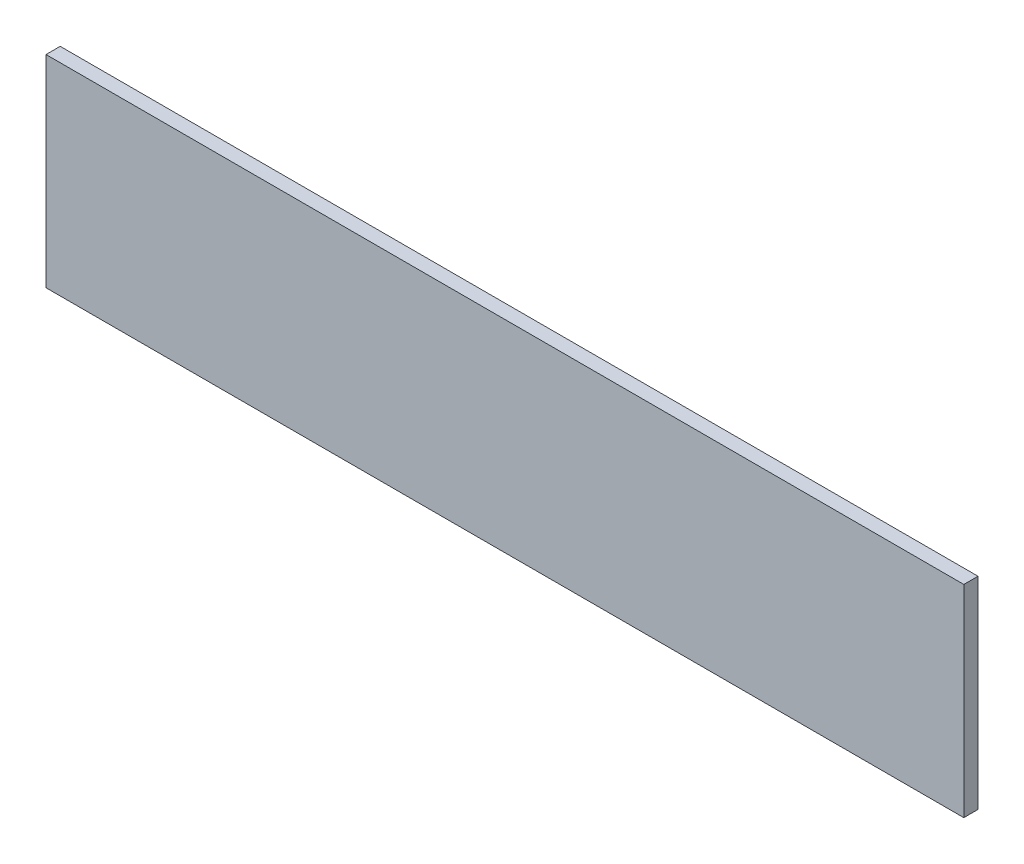
ISO-10303-21;
HEADER;
FILE_DESCRIPTION(('STEP AP214'),'2;1');
FILE_NAME('part.step','',(''),(''),'','','');
FILE_SCHEMA(('AUTOMOTIVE_DESIGN { 1 0 10303 214 1 1 1 1 }'));
ENDSEC;
DATA;
#1=APPLICATION_CONTEXT('core data for automotive mechanical design processes');
#2=APPLICATION_PROTOCOL_DEFINITION('international standard','automotive_design',2000,#1);
#3=PRODUCT_CONTEXT('',#1,'mechanical');
#4=PRODUCT('Part','Part','',(#3));
#5=PRODUCT_RELATED_PRODUCT_CATEGORY('part','',(#4));
#6=PRODUCT_DEFINITION_FORMATION('','',#4);
#7=PRODUCT_DEFINITION_CONTEXT('part definition',#1,'design');
#8=PRODUCT_DEFINITION('design','',#6,#7);
#9=PRODUCT_DEFINITION_SHAPE('','',#8);
#10=(LENGTH_UNIT() NAMED_UNIT(*) SI_UNIT(.MILLI.,.METRE.));
#11=(NAMED_UNIT(*) PLANE_ANGLE_UNIT() SI_UNIT($,.RADIAN.));
#12=(NAMED_UNIT(*) SI_UNIT($,.STERADIAN.) SOLID_ANGLE_UNIT());
#13=UNCERTAINTY_MEASURE_WITH_UNIT(LENGTH_MEASURE(1.E-05),#10,'distance_accuracy_value','');
#14=(GEOMETRIC_REPRESENTATION_CONTEXT(3) GLOBAL_UNCERTAINTY_ASSIGNED_CONTEXT((#13)) GLOBAL_UNIT_ASSIGNED_CONTEXT((#10,
#11,#12)) REPRESENTATION_CONTEXT('',''));
#15=CARTESIAN_POINT('',(0.,0.,0.));
#16=DIRECTION('',(0.,0.,1.));
#17=DIRECTION('',(1.,0.,0.));
#18=AXIS2_PLACEMENT_3D('',#15,#16,#17);
#19=CARTESIAN_POINT('',(0.,0.,6.));
#20=DIRECTION('',(1.,0.,0.));
#21=DIRECTION('',(0.,0.,-1.));
#22=AXIS2_PLACEMENT_3D('',#19,#20,#21);
#23=PLANE('',#22);
#24=DIRECTION('',(0.,-1.,0.));
#25=VECTOR('',#24,1.);
#26=CARTESIAN_POINT('',(0.,0.,0.));
#27=LINE('',#26,#25);
#28=CARTESIAN_POINT('',(0.,85.4,0.));
#29=VERTEX_POINT('',#28);
#30=CARTESIAN_POINT('',(0.,0.,0.));
#31=VERTEX_POINT('',#30);
#32=EDGE_CURVE('E99',#29,#31,#27,.T.);
#33=ORIENTED_EDGE('',*,*,#32,.T.);
#34=DIRECTION('',(0.,0.,-1.));
#35=VECTOR('',#34,1.);
#36=CARTESIAN_POINT('',(0.,0.,6.));
#37=LINE('',#36,#35);
#38=CARTESIAN_POINT('',(0.,0.,6.));
#39=VERTEX_POINT('',#38);
#40=EDGE_CURVE('E11',#39,#31,#37,.T.);
#41=ORIENTED_EDGE('',*,*,#40,.F.);
#42=DIRECTION('',(0.,-1.,0.));
#43=VECTOR('',#42,1.);
#44=CARTESIAN_POINT('',(0.,0.,6.));
#45=LINE('',#44,#43);
#46=CARTESIAN_POINT('',(0.,85.4,6.));
#47=VERTEX_POINT('',#46);
#48=EDGE_CURVE('E87',#47,#39,#45,.T.);
#49=ORIENTED_EDGE('',*,*,#48,.F.);
#50=DIRECTION('',(0.,0.,-1.));
#51=VECTOR('',#50,1.);
#52=CARTESIAN_POINT('',(0.,85.4,6.));
#53=LINE('',#52,#51);
#54=EDGE_CURVE('E95',#47,#29,#53,.T.);
#55=ORIENTED_EDGE('',*,*,#54,.T.);
#56=EDGE_LOOP('',(#33,#41,#49,#55));
#57=FACE_BOUND('',#56,.T.);
#58=ADVANCED_FACE('F36',(#57),#23,.F.);
#59=CARTESIAN_POINT('',(0.,0.,6.));
#60=DIRECTION('',(0.,1.,0.));
#61=DIRECTION('',(0.,0.,1.));
#62=AXIS2_PLACEMENT_3D('',#59,#60,#61);
#63=PLANE('',#62);
#64=DIRECTION('',(1.,0.,0.));
#65=VECTOR('',#64,1.);
#66=CARTESIAN_POINT('',(0.,0.,0.));
#67=LINE('',#66,#65);
#68=CARTESIAN_POINT('',(388.,0.,0.));
#69=VERTEX_POINT('',#68);
#70=EDGE_CURVE('E91',#31,#69,#67,.T.);
#71=ORIENTED_EDGE('',*,*,#70,.T.);
#72=DIRECTION('',(0.,0.,-1.));
#73=VECTOR('',#72,1.);
#74=CARTESIAN_POINT('',(388.,0.,6.));
#75=LINE('',#74,#73);
#76=CARTESIAN_POINT('',(388.,0.,6.));
#77=VERTEX_POINT('',#76);
#78=EDGE_CURVE('E44',#77,#69,#75,.T.);
#79=ORIENTED_EDGE('',*,*,#78,.F.);
#80=DIRECTION('',(1.,0.,0.));
#81=VECTOR('',#80,1.);
#82=CARTESIAN_POINT('',(0.,0.,6.));
#83=LINE('',#82,#81);
#84=EDGE_CURVE('E82',#39,#77,#83,.T.);
#85=ORIENTED_EDGE('',*,*,#84,.F.);
#86=ORIENTED_EDGE('',*,*,#40,.T.);
#87=EDGE_LOOP('',(#71,#79,#85,#86));
#88=FACE_BOUND('',#87,.T.);
#89=ADVANCED_FACE('F90',(#88),#63,.F.);
#90=CARTESIAN_POINT('',(388.,0.,6.));
#91=DIRECTION('',(-1.,0.,0.));
#92=DIRECTION('',(0.,0.,1.));
#93=AXIS2_PLACEMENT_3D('',#90,#91,#92);
#94=PLANE('',#93);
#95=DIRECTION('',(0.,1.,0.));
#96=VECTOR('',#95,1.);
#97=CARTESIAN_POINT('',(388.,0.,0.));
#98=LINE('',#97,#96);
#99=CARTESIAN_POINT('',(388.,85.4,0.));
#100=VERTEX_POINT('',#99);
#101=EDGE_CURVE('E69',#69,#100,#98,.T.);
#102=ORIENTED_EDGE('',*,*,#101,.T.);
#103=DIRECTION('',(0.,0.,-1.));
#104=VECTOR('',#103,1.);
#105=CARTESIAN_POINT('',(388.,85.4,6.));
#106=LINE('',#105,#104);
#107=CARTESIAN_POINT('',(388.,85.4,6.));
#108=VERTEX_POINT('',#107);
#109=EDGE_CURVE('E92',#108,#100,#106,.T.);
#110=ORIENTED_EDGE('',*,*,#109,.F.);
#111=DIRECTION('',(0.,1.,0.));
#112=VECTOR('',#111,1.);
#113=CARTESIAN_POINT('',(388.,0.,6.));
#114=LINE('',#113,#112);
#115=EDGE_CURVE('E85',#77,#108,#114,.T.);
#116=ORIENTED_EDGE('',*,*,#115,.F.);
#117=ORIENTED_EDGE('',*,*,#78,.T.);
#118=EDGE_LOOP('',(#102,#110,#116,#117));
#119=FACE_BOUND('',#118,.T.);
#120=ADVANCED_FACE('F93',(#119),#94,.F.);
#121=CARTESIAN_POINT('',(0.,85.4,6.));
#122=DIRECTION('',(0.,-1.,0.));
#123=DIRECTION('',(0.,0.,-1.));
#124=AXIS2_PLACEMENT_3D('',#121,#122,#123);
#125=PLANE('',#124);
#126=DIRECTION('',(-1.,0.,0.));
#127=VECTOR('',#126,1.);
#128=CARTESIAN_POINT('',(0.,85.4,0.));
#129=LINE('',#128,#127);
#130=EDGE_CURVE('E75',#100,#29,#129,.T.);
#131=ORIENTED_EDGE('',*,*,#130,.T.);
#132=ORIENTED_EDGE('',*,*,#54,.F.);
#133=DIRECTION('',(-1.,0.,0.));
#134=VECTOR('',#133,1.);
#135=CARTESIAN_POINT('',(0.,85.4,6.));
#136=LINE('',#135,#134);
#137=EDGE_CURVE('E52',#108,#47,#136,.T.);
#138=ORIENTED_EDGE('',*,*,#137,.F.);
#139=ORIENTED_EDGE('',*,*,#109,.T.);
#140=EDGE_LOOP('',(#131,#132,#138,#139));
#141=FACE_BOUND('',#140,.T.);
#142=ADVANCED_FACE('F106',(#141),#125,.F.);
#143=CARTESIAN_POINT('',(0.,0.,6.));
#144=DIRECTION('',(0.,0.,-1.));
#145=DIRECTION('',(-1.,0.,0.));
#146=AXIS2_PLACEMENT_3D('',#143,#144,#145);
#147=PLANE('',#146);
#148=ORIENTED_EDGE('',*,*,#48,.T.);
#149=ORIENTED_EDGE('',*,*,#84,.T.);
#150=ORIENTED_EDGE('',*,*,#115,.T.);
#151=ORIENTED_EDGE('',*,*,#137,.T.);
#152=EDGE_LOOP('',(#148,#149,#150,#151));
#153=FACE_BOUND('',#152,.T.);
#154=ADVANCED_FACE('F83',(#153),#147,.F.);
#155=CARTESIAN_POINT('',(0.,0.,0.));
#156=DIRECTION('',(0.,0.,-1.));
#157=DIRECTION('',(-1.,0.,0.));
#158=AXIS2_PLACEMENT_3D('',#155,#156,#157);
#159=PLANE('',#158);
#160=ORIENTED_EDGE('',*,*,#32,.F.);
#161=ORIENTED_EDGE('',*,*,#130,.F.);
#162=ORIENTED_EDGE('',*,*,#101,.F.);
#163=ORIENTED_EDGE('',*,*,#70,.F.);
#164=EDGE_LOOP('',(#160,#161,#162,#163));
#165=FACE_BOUND('',#164,.T.);
#166=ADVANCED_FACE('F109',(#165),#159,.T.);
#167=CLOSED_SHELL('',(#58,#89,#120,#142,#154,#166));
#168=MANIFOLD_SOLID_BREP('B2',#167);
#169=ADVANCED_BREP_SHAPE_REPRESENTATION('',(#18,#168),#14);
#170=SHAPE_DEFINITION_REPRESENTATION(#9,#169);
ENDSEC;
END-ISO-10303-21;
